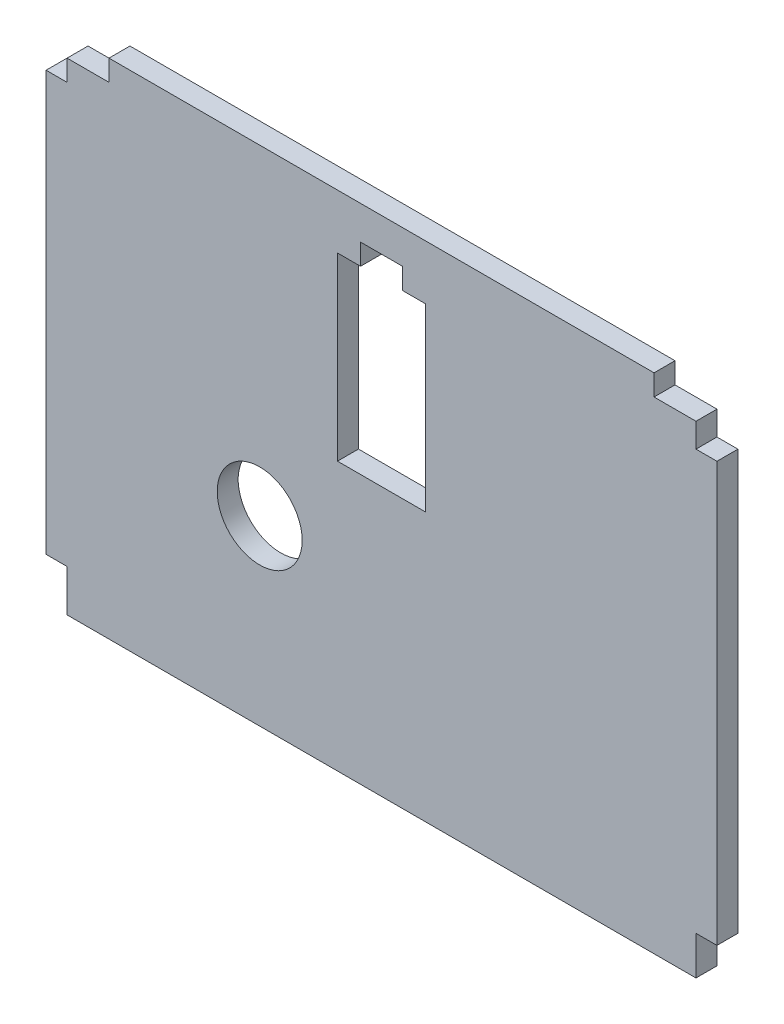
ISO-10303-21;
HEADER;
FILE_DESCRIPTION(('STEP AP214'),'2;1');
FILE_NAME('part.step','',(''),(''),'','','');
FILE_SCHEMA(('AUTOMOTIVE_DESIGN { 1 0 10303 214 1 1 1 1 }'));
ENDSEC;
DATA;
#1=APPLICATION_CONTEXT('core data for automotive mechanical design processes');
#2=APPLICATION_PROTOCOL_DEFINITION('international standard','automotive_design',2000,#1);
#3=PRODUCT_CONTEXT('',#1,'mechanical');
#4=PRODUCT('Part','Part','',(#3));
#5=PRODUCT_RELATED_PRODUCT_CATEGORY('part','',(#4));
#6=PRODUCT_DEFINITION_FORMATION('','',#4);
#7=PRODUCT_DEFINITION_CONTEXT('part definition',#1,'design');
#8=PRODUCT_DEFINITION('design','',#6,#7);
#9=PRODUCT_DEFINITION_SHAPE('','',#8);
#10=(LENGTH_UNIT() NAMED_UNIT(*) SI_UNIT(.MILLI.,.METRE.));
#11=(NAMED_UNIT(*) PLANE_ANGLE_UNIT() SI_UNIT($,.RADIAN.));
#12=(NAMED_UNIT(*) SI_UNIT($,.STERADIAN.) SOLID_ANGLE_UNIT());
#13=UNCERTAINTY_MEASURE_WITH_UNIT(LENGTH_MEASURE(1.E-05),#10,'distance_accuracy_value','');
#14=(GEOMETRIC_REPRESENTATION_CONTEXT(3) GLOBAL_UNCERTAINTY_ASSIGNED_CONTEXT((#13)) GLOBAL_UNIT_ASSIGNED_CONTEXT((#10,
#11,#12)) REPRESENTATION_CONTEXT('',''));
#15=CARTESIAN_POINT('',(0.,0.,0.));
#16=DIRECTION('',(0.,0.,1.));
#17=DIRECTION('',(1.,0.,0.));
#18=AXIS2_PLACEMENT_3D('',#15,#16,#17);
#19=CARTESIAN_POINT('',(58.9567249569248,45.028653295129,5.));
#20=DIRECTION('',(-1.,0.,0.));
#21=DIRECTION('',(0.,0.,1.));
#22=AXIS2_PLACEMENT_3D('',#19,#20,#21);
#23=PLANE('',#22);
#24=DIRECTION('',(0.,1.,0.));
#25=VECTOR('',#24,1.);
#26=CARTESIAN_POINT('',(58.9567249569248,45.028653295129,0.));
#27=LINE('',#26,#25);
#28=CARTESIAN_POINT('',(58.9567249569248,45.028653295129,0.));
#29=VERTEX_POINT('',#28);
#30=CARTESIAN_POINT('',(58.9567249569248,50.028653295129,0.));
#31=VERTEX_POINT('',#30);
#32=EDGE_CURVE('E284',#29,#31,#27,.T.);
#33=ORIENTED_EDGE('',*,*,#32,.T.);
#34=DIRECTION('',(0.,0.,-1.));
#35=VECTOR('',#34,1.);
#36=CARTESIAN_POINT('',(58.9567249569248,50.028653295129,5.));
#37=LINE('',#36,#35);
#38=CARTESIAN_POINT('',(58.9567249569248,50.028653295129,5.));
#39=VERTEX_POINT('',#38);
#40=EDGE_CURVE('E11',#39,#31,#37,.T.);
#41=ORIENTED_EDGE('',*,*,#40,.F.);
#42=DIRECTION('',(0.,1.,0.));
#43=VECTOR('',#42,1.);
#44=CARTESIAN_POINT('',(58.9567249569248,45.028653295129,5.));
#45=LINE('',#44,#43);
#46=CARTESIAN_POINT('',(58.9567249569248,45.028653295129,5.));
#47=VERTEX_POINT('',#46);
#48=EDGE_CURVE('E302',#47,#39,#45,.T.);
#49=ORIENTED_EDGE('',*,*,#48,.F.);
#50=DIRECTION('',(0.,0.,-1.));
#51=VECTOR('',#50,1.);
#52=CARTESIAN_POINT('',(58.9567249569248,45.028653295129,5.));
#53=LINE('',#52,#51);
#54=EDGE_CURVE('E357',#47,#29,#53,.T.);
#55=ORIENTED_EDGE('',*,*,#54,.T.);
#56=EDGE_LOOP('',(#33,#41,#49,#55));
#57=FACE_BOUND('',#56,.T.);
#58=ADVANCED_FACE('F45',(#57),#23,.F.);
#59=CARTESIAN_POINT('',(58.9567249569248,50.028653295129,5.));
#60=DIRECTION('',(0.,-1.,0.));
#61=DIRECTION('',(0.,0.,-1.));
#62=AXIS2_PLACEMENT_3D('',#59,#60,#61);
#63=PLANE('',#62);
#64=DIRECTION('',(-1.,0.,0.));
#65=VECTOR('',#64,1.);
#66=CARTESIAN_POINT('',(58.9567249569248,50.028653295129,0.));
#67=LINE('',#66,#65);
#68=CARTESIAN_POINT('',(-71.0432750430752,50.028653295129,0.));
#69=VERTEX_POINT('',#68);
#70=EDGE_CURVE('E361',#31,#69,#67,.T.);
#71=ORIENTED_EDGE('',*,*,#70,.T.);
#72=DIRECTION('',(0.,0.,-1.));
#73=VECTOR('',#72,1.);
#74=CARTESIAN_POINT('',(-71.0432750430752,50.028653295129,5.));
#75=LINE('',#74,#73);
#76=CARTESIAN_POINT('',(-71.0432750430752,50.028653295129,5.));
#77=VERTEX_POINT('',#76);
#78=EDGE_CURVE('E54',#77,#69,#75,.T.);
#79=ORIENTED_EDGE('',*,*,#78,.F.);
#80=DIRECTION('',(-1.,0.,0.));
#81=VECTOR('',#80,1.);
#82=CARTESIAN_POINT('',(58.9567249569248,50.028653295129,5.));
#83=LINE('',#82,#81);
#84=EDGE_CURVE('E306',#39,#77,#83,.T.);
#85=ORIENTED_EDGE('',*,*,#84,.F.);
#86=ORIENTED_EDGE('',*,*,#40,.T.);
#87=EDGE_LOOP('',(#71,#79,#85,#86));
#88=FACE_BOUND('',#87,.T.);
#89=ADVANCED_FACE('F468',(#88),#63,.F.);
#90=CARTESIAN_POINT('',(-71.0432750430752,45.0286532951289,5.));
#91=DIRECTION('',(-1.,0.,0.));
#92=DIRECTION('',(0.,0.,1.));
#93=AXIS2_PLACEMENT_3D('',#90,#91,#92);
#94=PLANE('',#93);
#95=DIRECTION('',(0.,1.,0.));
#96=VECTOR('',#95,1.);
#97=CARTESIAN_POINT('',(-71.0432750430752,45.0286532951289,0.));
#98=LINE('',#97,#96);
#99=CARTESIAN_POINT('',(-71.0432750430752,45.0286532951289,0.));
#100=VERTEX_POINT('',#99);
#101=EDGE_CURVE('E365',#100,#69,#98,.T.);
#102=ORIENTED_EDGE('',*,*,#101,.F.);
#103=DIRECTION('',(0.,0.,-1.));
#104=VECTOR('',#103,1.);
#105=CARTESIAN_POINT('',(-71.0432750430752,45.0286532951289,5.));
#106=LINE('',#105,#104);
#107=CARTESIAN_POINT('',(-71.0432750430752,45.0286532951289,5.));
#108=VERTEX_POINT('',#107);
#109=EDGE_CURVE('E458',#108,#100,#106,.T.);
#110=ORIENTED_EDGE('',*,*,#109,.F.);
#111=DIRECTION('',(0.,1.,0.));
#112=VECTOR('',#111,1.);
#113=CARTESIAN_POINT('',(-71.0432750430752,45.0286532951289,5.));
#114=LINE('',#113,#112);
#115=EDGE_CURVE('E310',#108,#77,#114,.T.);
#116=ORIENTED_EDGE('',*,*,#115,.T.);
#117=ORIENTED_EDGE('',*,*,#78,.T.);
#118=EDGE_LOOP('',(#102,#110,#116,#117));
#119=FACE_BOUND('',#118,.T.);
#120=ADVANCED_FACE('F465',(#119),#94,.T.);
#121=CARTESIAN_POINT('',(-71.0432750430752,45.0286532951289,5.));
#122=DIRECTION('',(0.,-1.,0.));
#123=DIRECTION('',(0.,0.,-1.));
#124=AXIS2_PLACEMENT_3D('',#121,#122,#123);
#125=PLANE('',#124);
#126=DIRECTION('',(-1.,0.,0.));
#127=VECTOR('',#126,1.);
#128=CARTESIAN_POINT('',(-71.0432750430752,45.0286532951289,0.));
#129=LINE('',#128,#127);
#130=CARTESIAN_POINT('',(-81.0432750430752,45.0286532951289,0.));
#131=VERTEX_POINT('',#130);
#132=EDGE_CURVE('E369',#100,#131,#129,.T.);
#133=ORIENTED_EDGE('',*,*,#132,.T.);
#134=DIRECTION('',(0.,0.,-1.));
#135=VECTOR('',#134,1.);
#136=CARTESIAN_POINT('',(-81.0432750430752,45.0286532951289,5.));
#137=LINE('',#136,#135);
#138=CARTESIAN_POINT('',(-81.0432750430752,45.0286532951289,5.));
#139=VERTEX_POINT('',#138);
#140=EDGE_CURVE('E455',#139,#131,#137,.T.);
#141=ORIENTED_EDGE('',*,*,#140,.F.);
#142=DIRECTION('',(-1.,0.,0.));
#143=VECTOR('',#142,1.);
#144=CARTESIAN_POINT('',(-71.0432750430752,45.0286532951289,5.));
#145=LINE('',#144,#143);
#146=EDGE_CURVE('E314',#108,#139,#145,.T.);
#147=ORIENTED_EDGE('',*,*,#146,.F.);
#148=ORIENTED_EDGE('',*,*,#109,.T.);
#149=EDGE_LOOP('',(#133,#141,#147,#148));
#150=FACE_BOUND('',#149,.T.);
#151=ADVANCED_FACE('F475',(#150),#125,.F.);
#152=CARTESIAN_POINT('',(-81.0432750430752,40.028653295129,5.));
#153=DIRECTION('',(-1.,0.,0.));
#154=DIRECTION('',(0.,0.,1.));
#155=AXIS2_PLACEMENT_3D('',#152,#153,#154);
#156=PLANE('',#155);
#157=DIRECTION('',(0.,1.,0.));
#158=VECTOR('',#157,1.);
#159=CARTESIAN_POINT('',(-81.0432750430752,40.028653295129,0.));
#160=LINE('',#159,#158);
#161=CARTESIAN_POINT('',(-81.0432750430752,40.028653295129,0.));
#162=VERTEX_POINT('',#161);
#163=EDGE_CURVE('E373',#162,#131,#160,.T.);
#164=ORIENTED_EDGE('',*,*,#163,.F.);
#165=DIRECTION('',(0.,0.,-1.));
#166=VECTOR('',#165,1.);
#167=CARTESIAN_POINT('',(-81.0432750430752,40.028653295129,5.));
#168=LINE('',#167,#166);
#169=CARTESIAN_POINT('',(-81.0432750430752,40.028653295129,5.));
#170=VERTEX_POINT('',#169);
#171=EDGE_CURVE('E452',#170,#162,#168,.T.);
#172=ORIENTED_EDGE('',*,*,#171,.F.);
#173=DIRECTION('',(0.,1.,0.));
#174=VECTOR('',#173,1.);
#175=CARTESIAN_POINT('',(-81.0432750430752,40.028653295129,5.));
#176=LINE('',#175,#174);
#177=EDGE_CURVE('E317',#170,#139,#176,.T.);
#178=ORIENTED_EDGE('',*,*,#177,.T.);
#179=ORIENTED_EDGE('',*,*,#140,.T.);
#180=EDGE_LOOP('',(#164,#172,#178,#179));
#181=FACE_BOUND('',#180,.T.);
#182=ADVANCED_FACE('F535',(#181),#156,.T.);
#183=CARTESIAN_POINT('',(-86.0432750430752,40.028653295129,5.));
#184=DIRECTION('',(0.,1.,0.));
#185=DIRECTION('',(0.,0.,1.));
#186=AXIS2_PLACEMENT_3D('',#183,#184,#185);
#187=PLANE('',#186);
#188=DIRECTION('',(1.,0.,0.));
#189=VECTOR('',#188,1.);
#190=CARTESIAN_POINT('',(-86.0432750430752,40.028653295129,0.));
#191=LINE('',#190,#189);
#192=CARTESIAN_POINT('',(-86.0432750430752,40.028653295129,0.));
#193=VERTEX_POINT('',#192);
#194=EDGE_CURVE('E377',#193,#162,#191,.T.);
#195=ORIENTED_EDGE('',*,*,#194,.F.);
#196=DIRECTION('',(0.,0.,-1.));
#197=VECTOR('',#196,1.);
#198=CARTESIAN_POINT('',(-86.0432750430752,40.028653295129,5.));
#199=LINE('',#198,#197);
#200=CARTESIAN_POINT('',(-86.0432750430752,40.028653295129,5.));
#201=VERTEX_POINT('',#200);
#202=EDGE_CURVE('E449',#201,#193,#199,.T.);
#203=ORIENTED_EDGE('',*,*,#202,.F.);
#204=DIRECTION('',(1.,0.,0.));
#205=VECTOR('',#204,1.);
#206=CARTESIAN_POINT('',(-86.0432750430752,40.028653295129,5.));
#207=LINE('',#206,#205);
#208=EDGE_CURVE('E321',#201,#170,#207,.T.);
#209=ORIENTED_EDGE('',*,*,#208,.T.);
#210=ORIENTED_EDGE('',*,*,#171,.T.);
#211=EDGE_LOOP('',(#195,#203,#209,#210));
#212=FACE_BOUND('',#211,.T.);
#213=ADVANCED_FACE('F533',(#212),#187,.T.);
#214=CARTESIAN_POINT('',(-86.0432750430752,40.028653295129,5.));
#215=DIRECTION('',(1.,0.,0.));
#216=DIRECTION('',(0.,0.,-1.));
#217=AXIS2_PLACEMENT_3D('',#214,#215,#216);
#218=PLANE('',#217);
#219=DIRECTION('',(0.,-1.,0.));
#220=VECTOR('',#219,1.);
#221=CARTESIAN_POINT('',(-86.0432750430752,40.028653295129,0.));
#222=LINE('',#221,#220);
#223=CARTESIAN_POINT('',(-86.0432750430752,-59.9713467048711,0.));
#224=VERTEX_POINT('',#223);
#225=EDGE_CURVE('E381',#193,#224,#222,.T.);
#226=ORIENTED_EDGE('',*,*,#225,.T.);
#227=DIRECTION('',(0.,0.,-1.));
#228=VECTOR('',#227,1.);
#229=CARTESIAN_POINT('',(-86.0432750430752,-59.9713467048711,5.));
#230=LINE('',#229,#228);
#231=CARTESIAN_POINT('',(-86.0432750430752,-59.9713467048711,5.));
#232=VERTEX_POINT('',#231);
#233=EDGE_CURVE('E445',#232,#224,#230,.T.);
#234=ORIENTED_EDGE('',*,*,#233,.F.);
#235=DIRECTION('',(0.,-1.,0.));
#236=VECTOR('',#235,1.);
#237=CARTESIAN_POINT('',(-86.0432750430752,40.028653295129,5.));
#238=LINE('',#237,#236);
#239=EDGE_CURVE('E325',#201,#232,#238,.T.);
#240=ORIENTED_EDGE('',*,*,#239,.F.);
#241=ORIENTED_EDGE('',*,*,#202,.T.);
#242=EDGE_LOOP('',(#226,#234,#240,#241));
#243=FACE_BOUND('',#242,.T.);
#244=ADVANCED_FACE('F529',(#243),#218,.F.);
#245=CARTESIAN_POINT('',(-86.0432750430752,-59.9713467048711,5.));
#246=DIRECTION('',(0.,1.,0.));
#247=DIRECTION('',(0.,0.,1.));
#248=AXIS2_PLACEMENT_3D('',#245,#246,#247);
#249=PLANE('',#248);
#250=DIRECTION('',(1.,0.,0.));
#251=VECTOR('',#250,1.);
#252=CARTESIAN_POINT('',(-86.0432750430752,-59.9713467048711,0.));
#253=LINE('',#252,#251);
#254=CARTESIAN_POINT('',(-81.0432750430752,-59.9713467048711,0.));
#255=VERTEX_POINT('',#254);
#256=EDGE_CURVE('E384',#224,#255,#253,.T.);
#257=ORIENTED_EDGE('',*,*,#256,.T.);
#258=DIRECTION('',(0.,0.,-1.));
#259=VECTOR('',#258,1.);
#260=CARTESIAN_POINT('',(-81.0432750430752,-59.9713467048711,5.));
#261=LINE('',#260,#259);
#262=CARTESIAN_POINT('',(-81.0432750430752,-59.9713467048711,5.));
#263=VERTEX_POINT('',#262);
#264=EDGE_CURVE('E441',#263,#255,#261,.T.);
#265=ORIENTED_EDGE('',*,*,#264,.F.);
#266=DIRECTION('',(1.,0.,0.));
#267=VECTOR('',#266,1.);
#268=CARTESIAN_POINT('',(-86.0432750430752,-59.9713467048711,5.));
#269=LINE('',#268,#267);
#270=EDGE_CURVE('E328',#232,#263,#269,.T.);
#271=ORIENTED_EDGE('',*,*,#270,.F.);
#272=ORIENTED_EDGE('',*,*,#233,.T.);
#273=EDGE_LOOP('',(#257,#265,#271,#272));
#274=FACE_BOUND('',#273,.T.);
#275=ADVANCED_FACE('F525',(#274),#249,.F.);
#276=CARTESIAN_POINT('',(-81.0432750430752,-59.9713467048711,5.));
#277=DIRECTION('',(1.,0.,0.));
#278=DIRECTION('',(0.,1.,0.));
#279=AXIS2_PLACEMENT_3D('',#276,#277,#278);
#280=PLANE('',#279);
#281=DIRECTION('',(0.,-1.,0.));
#282=VECTOR('',#281,1.);
#283=CARTESIAN_POINT('',(-81.0432750430752,-59.9713467048711,0.));
#284=LINE('',#283,#282);
#285=CARTESIAN_POINT('',(-81.0432750430752,-69.971346704871,0.));
#286=VERTEX_POINT('',#285);
#287=EDGE_CURVE('E387',#255,#286,#284,.T.);
#288=ORIENTED_EDGE('',*,*,#287,.T.);
#289=DIRECTION('',(0.,0.,-1.));
#290=VECTOR('',#289,1.);
#291=CARTESIAN_POINT('',(-81.0432750430752,-69.971346704871,5.));
#292=LINE('',#291,#290);
#293=CARTESIAN_POINT('',(-81.0432750430752,-69.971346704871,5.));
#294=VERTEX_POINT('',#293);
#295=EDGE_CURVE('E437',#294,#286,#292,.T.);
#296=ORIENTED_EDGE('',*,*,#295,.F.);
#297=DIRECTION('',(0.,-1.,0.));
#298=VECTOR('',#297,1.);
#299=CARTESIAN_POINT('',(-81.0432750430752,-59.9713467048711,5.));
#300=LINE('',#299,#298);
#301=EDGE_CURVE('E331',#263,#294,#300,.T.);
#302=ORIENTED_EDGE('',*,*,#301,.F.);
#303=ORIENTED_EDGE('',*,*,#264,.T.);
#304=EDGE_LOOP('',(#288,#296,#302,#303));
#305=FACE_BOUND('',#304,.T.);
#306=ADVANCED_FACE('F520',(#305),#280,.F.);
#307=CARTESIAN_POINT('',(-81.0432750430752,-69.971346704871,5.));
#308=DIRECTION('',(0.,1.,0.));
#309=DIRECTION('',(0.,0.,1.));
#310=AXIS2_PLACEMENT_3D('',#307,#308,#309);
#311=PLANE('',#310);
#312=DIRECTION('',(1.,0.,0.));
#313=VECTOR('',#312,1.);
#314=CARTESIAN_POINT('',(-81.0432750430752,-69.971346704871,0.));
#315=LINE('',#314,#313);
#316=CARTESIAN_POINT('',(68.9567249569248,-69.971346704871,0.));
#317=VERTEX_POINT('',#316);
#318=EDGE_CURVE('E390',#286,#317,#315,.T.);
#319=ORIENTED_EDGE('',*,*,#318,.T.);
#320=DIRECTION('',(0.,0.,-1.));
#321=VECTOR('',#320,1.);
#322=CARTESIAN_POINT('',(68.9567249569248,-69.971346704871,5.));
#323=LINE('',#322,#321);
#324=CARTESIAN_POINT('',(68.9567249569248,-69.971346704871,5.));
#325=VERTEX_POINT('',#324);
#326=EDGE_CURVE('E433',#325,#317,#323,.T.);
#327=ORIENTED_EDGE('',*,*,#326,.F.);
#328=DIRECTION('',(1.,0.,0.));
#329=VECTOR('',#328,1.);
#330=CARTESIAN_POINT('',(-81.0432750430752,-69.971346704871,5.));
#331=LINE('',#330,#329);
#332=EDGE_CURVE('E334',#294,#325,#331,.T.);
#333=ORIENTED_EDGE('',*,*,#332,.F.);
#334=ORIENTED_EDGE('',*,*,#295,.T.);
#335=EDGE_LOOP('',(#319,#327,#333,#334));
#336=FACE_BOUND('',#335,.T.);
#337=ADVANCED_FACE('F514',(#336),#311,.F.);
#338=CARTESIAN_POINT('',(68.9567249569248,-69.971346704871,5.));
#339=DIRECTION('',(-1.,0.,0.));
#340=DIRECTION('',(0.,-1.,0.));
#341=AXIS2_PLACEMENT_3D('',#338,#339,#340);
#342=PLANE('',#341);
#343=DIRECTION('',(0.,1.,0.));
#344=VECTOR('',#343,1.);
#345=CARTESIAN_POINT('',(68.9567249569248,-69.971346704871,0.));
#346=LINE('',#345,#344);
#347=CARTESIAN_POINT('',(68.9567249569248,-60.7378352529943,0.));
#348=VERTEX_POINT('',#347);
#349=EDGE_CURVE('E393',#317,#348,#346,.T.);
#350=ORIENTED_EDGE('',*,*,#349,.T.);
#351=DIRECTION('',(0.,0.,-1.));
#352=VECTOR('',#351,1.);
#353=CARTESIAN_POINT('',(68.9567249569248,-60.7378352529943,5.));
#354=LINE('',#353,#352);
#355=CARTESIAN_POINT('',(68.9567249569248,-60.7378352529943,5.));
#356=VERTEX_POINT('',#355);
#357=EDGE_CURVE('E429',#356,#348,#354,.T.);
#358=ORIENTED_EDGE('',*,*,#357,.F.);
#359=DIRECTION('',(0.,1.,0.));
#360=VECTOR('',#359,1.);
#361=CARTESIAN_POINT('',(68.9567249569248,-69.971346704871,5.));
#362=LINE('',#361,#360);
#363=EDGE_CURVE('E337',#325,#356,#362,.T.);
#364=ORIENTED_EDGE('',*,*,#363,.F.);
#365=ORIENTED_EDGE('',*,*,#326,.T.);
#366=EDGE_LOOP('',(#350,#358,#364,#365));
#367=FACE_BOUND('',#366,.T.);
#368=ADVANCED_FACE('F510',(#367),#342,.F.);
#369=CARTESIAN_POINT('',(68.9567249569248,-60.7378352529943,5.));
#370=DIRECTION('',(0.,1.,0.));
#371=DIRECTION('',(0.,0.,1.));
#372=AXIS2_PLACEMENT_3D('',#369,#370,#371);
#373=PLANE('',#372);
#374=DIRECTION('',(1.,0.,0.));
#375=VECTOR('',#374,1.);
#376=CARTESIAN_POINT('',(68.9567249569248,-60.7378352529943,0.));
#377=LINE('',#376,#375);
#378=CARTESIAN_POINT('',(73.9567249569248,-60.7378352529943,0.));
#379=VERTEX_POINT('',#378);
#380=EDGE_CURVE('E396',#348,#379,#377,.T.);
#381=ORIENTED_EDGE('',*,*,#380,.T.);
#382=DIRECTION('',(0.,0.,-1.));
#383=VECTOR('',#382,1.);
#384=CARTESIAN_POINT('',(73.9567249569248,-60.7378352529943,5.));
#385=LINE('',#384,#383);
#386=CARTESIAN_POINT('',(73.9567249569248,-60.7378352529943,5.));
#387=VERTEX_POINT('',#386);
#388=EDGE_CURVE('E425',#387,#379,#385,.T.);
#389=ORIENTED_EDGE('',*,*,#388,.F.);
#390=DIRECTION('',(1.,0.,0.));
#391=VECTOR('',#390,1.);
#392=CARTESIAN_POINT('',(68.9567249569248,-60.7378352529943,5.));
#393=LINE('',#392,#391);
#394=EDGE_CURVE('E340',#356,#387,#393,.T.);
#395=ORIENTED_EDGE('',*,*,#394,.F.);
#396=ORIENTED_EDGE('',*,*,#357,.T.);
#397=EDGE_LOOP('',(#381,#389,#395,#396));
#398=FACE_BOUND('',#397,.T.);
#399=ADVANCED_FACE('F505',(#398),#373,.F.);
#400=CARTESIAN_POINT('',(73.9567249569248,-60.7378352529943,5.));
#401=DIRECTION('',(-1.,0.,0.));
#402=DIRECTION('',(0.,0.,1.));
#403=AXIS2_PLACEMENT_3D('',#400,#401,#402);
#404=PLANE('',#403);
#405=DIRECTION('',(0.,1.,0.));
#406=VECTOR('',#405,1.);
#407=CARTESIAN_POINT('',(73.9567249569248,-60.7378352529943,0.));
#408=LINE('',#407,#406);
#409=CARTESIAN_POINT('',(73.9567249569248,39.2621647470057,0.));
#410=VERTEX_POINT('',#409);
#411=EDGE_CURVE('E399',#379,#410,#408,.T.);
#412=ORIENTED_EDGE('',*,*,#411,.T.);
#413=DIRECTION('',(0.,0.,-1.));
#414=VECTOR('',#413,1.);
#415=CARTESIAN_POINT('',(73.9567249569248,39.2621647470057,5.));
#416=LINE('',#415,#414);
#417=CARTESIAN_POINT('',(73.9567249569248,39.2621647470057,5.));
#418=VERTEX_POINT('',#417);
#419=EDGE_CURVE('E422',#418,#410,#416,.T.);
#420=ORIENTED_EDGE('',*,*,#419,.F.);
#421=DIRECTION('',(0.,1.,0.));
#422=VECTOR('',#421,1.);
#423=CARTESIAN_POINT('',(73.9567249569248,-60.7378352529943,5.));
#424=LINE('',#423,#422);
#425=EDGE_CURVE('E343',#387,#418,#424,.T.);
#426=ORIENTED_EDGE('',*,*,#425,.F.);
#427=ORIENTED_EDGE('',*,*,#388,.T.);
#428=EDGE_LOOP('',(#412,#420,#426,#427));
#429=FACE_BOUND('',#428,.T.);
#430=ADVANCED_FACE('F499',(#429),#404,.F.);
#431=CARTESIAN_POINT('',(68.9567249569248,39.2621647470057,5.));
#432=DIRECTION('',(0.,1.,0.));
#433=DIRECTION('',(0.,0.,1.));
#434=AXIS2_PLACEMENT_3D('',#431,#432,#433);
#435=PLANE('',#434);
#436=DIRECTION('',(1.,0.,0.));
#437=VECTOR('',#436,1.);
#438=CARTESIAN_POINT('',(68.9567249569248,39.2621647470057,0.));
#439=LINE('',#438,#437);
#440=CARTESIAN_POINT('',(68.9567249569248,39.2621647470057,0.));
#441=VERTEX_POINT('',#440);
#442=EDGE_CURVE('E403',#441,#410,#439,.T.);
#443=ORIENTED_EDGE('',*,*,#442,.F.);
#444=DIRECTION('',(0.,0.,-1.));
#445=VECTOR('',#444,1.);
#446=CARTESIAN_POINT('',(68.9567249569248,39.2621647470057,5.));
#447=LINE('',#446,#445);
#448=CARTESIAN_POINT('',(68.9567249569248,39.2621647470057,5.));
#449=VERTEX_POINT('',#448);
#450=EDGE_CURVE('E419',#449,#441,#447,.T.);
#451=ORIENTED_EDGE('',*,*,#450,.F.);
#452=DIRECTION('',(1.,0.,0.));
#453=VECTOR('',#452,1.);
#454=CARTESIAN_POINT('',(68.9567249569248,39.2621647470057,5.));
#455=LINE('',#454,#453);
#456=EDGE_CURVE('E346',#449,#418,#455,.T.);
#457=ORIENTED_EDGE('',*,*,#456,.T.);
#458=ORIENTED_EDGE('',*,*,#419,.T.);
#459=EDGE_LOOP('',(#443,#451,#457,#458));
#460=FACE_BOUND('',#459,.T.);
#461=ADVANCED_FACE('F494',(#460),#435,.T.);
#462=CARTESIAN_POINT('',(68.9567249569248,39.2621647470057,5.));
#463=DIRECTION('',(-1.,0.,0.));
#464=DIRECTION('',(0.,0.,1.));
#465=AXIS2_PLACEMENT_3D('',#462,#463,#464);
#466=PLANE('',#465);
#467=DIRECTION('',(0.,1.,0.));
#468=VECTOR('',#467,1.);
#469=CARTESIAN_POINT('',(68.9567249569248,39.2621647470057,0.));
#470=LINE('',#469,#468);
#471=CARTESIAN_POINT('',(68.9567249569248,45.028653295129,0.));
#472=VERTEX_POINT('',#471);
#473=EDGE_CURVE('E407',#441,#472,#470,.T.);
#474=ORIENTED_EDGE('',*,*,#473,.T.);
#475=DIRECTION('',(0.,0.,-1.));
#476=VECTOR('',#475,1.);
#477=CARTESIAN_POINT('',(68.9567249569248,45.028653295129,5.));
#478=LINE('',#477,#476);
#479=CARTESIAN_POINT('',(68.9567249569248,45.028653295129,5.));
#480=VERTEX_POINT('',#479);
#481=EDGE_CURVE('E416',#480,#472,#478,.T.);
#482=ORIENTED_EDGE('',*,*,#481,.F.);
#483=DIRECTION('',(0.,1.,0.));
#484=VECTOR('',#483,1.);
#485=CARTESIAN_POINT('',(68.9567249569248,39.2621647470057,5.));
#486=LINE('',#485,#484);
#487=EDGE_CURVE('E350',#449,#480,#486,.T.);
#488=ORIENTED_EDGE('',*,*,#487,.F.);
#489=ORIENTED_EDGE('',*,*,#450,.T.);
#490=EDGE_LOOP('',(#474,#482,#488,#489));
#491=FACE_BOUND('',#490,.T.);
#492=ADVANCED_FACE('F490',(#491),#466,.F.);
#493=CARTESIAN_POINT('',(58.9567249569248,45.028653295129,5.));
#494=DIRECTION('',(0.,1.,0.));
#495=DIRECTION('',(0.,0.,1.));
#496=AXIS2_PLACEMENT_3D('',#493,#494,#495);
#497=PLANE('',#496);
#498=DIRECTION('',(1.,0.,0.));
#499=VECTOR('',#498,1.);
#500=CARTESIAN_POINT('',(58.9567249569248,45.028653295129,0.));
#501=LINE('',#500,#499);
#502=EDGE_CURVE('E307',#29,#472,#501,.T.);
#503=ORIENTED_EDGE('',*,*,#502,.F.);
#504=ORIENTED_EDGE('',*,*,#54,.F.);
#505=DIRECTION('',(1.,0.,0.));
#506=VECTOR('',#505,1.);
#507=CARTESIAN_POINT('',(58.9567249569248,45.028653295129,5.));
#508=LINE('',#507,#506);
#509=EDGE_CURVE('E353',#47,#480,#508,.T.);
#510=ORIENTED_EDGE('',*,*,#509,.T.);
#511=ORIENTED_EDGE('',*,*,#481,.T.);
#512=EDGE_LOOP('',(#503,#504,#510,#511));
#513=FACE_BOUND('',#512,.T.);
#514=ADVANCED_FACE('F486',(#513),#497,.T.);
#515=CARTESIAN_POINT('',(0.,0.,5.));
#516=DIRECTION('',(0.,0.,1.));
#517=DIRECTION('',(1.,0.,0.));
#518=AXIS2_PLACEMENT_3D('',#515,#516,#517);
#519=PLANE('',#518);
#520=CARTESIAN_POINT('',(-35.0986045026042,-26.5621117512885,5.));
#521=DIRECTION('',(0.,0.,1.));
#522=DIRECTION('',(1.,0.,0.));
#523=AXIS2_PLACEMENT_3D('',#520,#521,#522);
#524=CIRCLE('',#523,10.1333724821669);
#525=CARTESIAN_POINT('',(-24.9652320204374,-26.5621117512885,5.));
#526=VERTEX_POINT('',#525);
#527=EDGE_CURVE('E236',#526,#526,#524,.T.);
#528=ORIENTED_EDGE('',*,*,#527,.F.);
#529=EDGE_LOOP('',(#528));
#530=FACE_BOUND('',#529,.T.);
#531=DIRECTION('',(-1.,0.,0.));
#532=VECTOR('',#531,1.);
#533=CARTESIAN_POINT('',(-16.5432750430752,37.028653295129,5.));
#534=LINE('',#533,#532);
#535=CARTESIAN_POINT('',(-11.0432750430752,37.028653295129,5.));
#536=VERTEX_POINT('',#535);
#537=CARTESIAN_POINT('',(-16.5432750430752,37.028653295129,5.));
#538=VERTEX_POINT('',#537);
#539=EDGE_CURVE('E61',#536,#538,#534,.T.);
#540=ORIENTED_EDGE('',*,*,#539,.F.);
#541=DIRECTION('',(0.,-1.,0.));
#542=VECTOR('',#541,1.);
#543=CARTESIAN_POINT('',(-11.0432750430752,42.028653295129,5.));
#544=LINE('',#543,#542);
#545=CARTESIAN_POINT('',(-11.0432750430752,42.028653295129,5.));
#546=VERTEX_POINT('',#545);
#547=EDGE_CURVE('E229',#546,#536,#544,.T.);
#548=ORIENTED_EDGE('',*,*,#547,.F.);
#549=DIRECTION('',(-1.,0.,0.));
#550=VECTOR('',#549,1.);
#551=CARTESIAN_POINT('',(-6.04327504307517,42.028653295129,5.));
#552=LINE('',#551,#550);
#553=CARTESIAN_POINT('',(-1.04327504307517,42.028653295129,5.));
#554=VERTEX_POINT('',#553);
#555=EDGE_CURVE('E233',#554,#546,#552,.T.);
#556=ORIENTED_EDGE('',*,*,#555,.F.);
#557=DIRECTION('',(0.,1.,0.));
#558=VECTOR('',#557,1.);
#559=CARTESIAN_POINT('',(-1.04327504307517,37.028653295129,5.));
#560=LINE('',#559,#558);
#561=CARTESIAN_POINT('',(-1.04327504307517,37.028653295129,5.));
#562=VERTEX_POINT('',#561);
#563=EDGE_CURVE('E274',#562,#554,#560,.T.);
#564=ORIENTED_EDGE('',*,*,#563,.F.);
#565=DIRECTION('',(-1.,0.,0.));
#566=VECTOR('',#565,1.);
#567=CARTESIAN_POINT('',(-1.04327504307517,37.028653295129,5.));
#568=LINE('',#567,#566);
#569=CARTESIAN_POINT('',(4.45672495692483,37.028653295129,5.));
#570=VERTEX_POINT('',#569);
#571=EDGE_CURVE('E270',#570,#562,#568,.T.);
#572=ORIENTED_EDGE('',*,*,#571,.F.);
#573=DIRECTION('',(0.,1.,0.));
#574=VECTOR('',#573,1.);
#575=CARTESIAN_POINT('',(4.45672495692483,37.028653295129,5.));
#576=LINE('',#575,#574);
#577=CARTESIAN_POINT('',(4.45672495692484,-5.97134670487103,5.));
#578=VERTEX_POINT('',#577);
#579=EDGE_CURVE('E266',#578,#570,#576,.T.);
#580=ORIENTED_EDGE('',*,*,#579,.F.);
#581=DIRECTION('',(1.,0.,0.));
#582=VECTOR('',#581,1.);
#583=CARTESIAN_POINT('',(-16.5432750430752,-5.97134670487104,5.));
#584=LINE('',#583,#582);
#585=CARTESIAN_POINT('',(-16.5432750430752,-5.97134670487104,5.));
#586=VERTEX_POINT('',#585);
#587=EDGE_CURVE('E262',#586,#578,#584,.T.);
#588=ORIENTED_EDGE('',*,*,#587,.F.);
#589=DIRECTION('',(0.,-1.,0.));
#590=VECTOR('',#589,1.);
#591=CARTESIAN_POINT('',(-16.5432750430752,37.028653295129,5.));
#592=LINE('',#591,#590);
#593=EDGE_CURVE('E259',#538,#586,#592,.T.);
#594=ORIENTED_EDGE('',*,*,#593,.F.);
#595=EDGE_LOOP('',(#540,#548,#556,#564,#572,#580,#588,#594));
#596=FACE_BOUND('',#595,.T.);
#597=ORIENTED_EDGE('',*,*,#48,.T.);
#598=ORIENTED_EDGE('',*,*,#84,.T.);
#599=ORIENTED_EDGE('',*,*,#115,.F.);
#600=ORIENTED_EDGE('',*,*,#146,.T.);
#601=ORIENTED_EDGE('',*,*,#177,.F.);
#602=ORIENTED_EDGE('',*,*,#208,.F.);
#603=ORIENTED_EDGE('',*,*,#239,.T.);
#604=ORIENTED_EDGE('',*,*,#270,.T.);
#605=ORIENTED_EDGE('',*,*,#301,.T.);
#606=ORIENTED_EDGE('',*,*,#332,.T.);
#607=ORIENTED_EDGE('',*,*,#363,.T.);
#608=ORIENTED_EDGE('',*,*,#394,.T.);
#609=ORIENTED_EDGE('',*,*,#425,.T.);
#610=ORIENTED_EDGE('',*,*,#456,.F.);
#611=ORIENTED_EDGE('',*,*,#487,.T.);
#612=ORIENTED_EDGE('',*,*,#509,.F.);
#613=EDGE_LOOP('',(#597,#598,#599,#600,#601,#602,#603,#604,#605,#606,#607,#608,#609,#610,#611,#612));
#614=FACE_BOUND('',#613,.T.);
#615=ADVANCED_FACE('F479',(#530,#596,#614),#519,.T.);
#616=CARTESIAN_POINT('',(0.,0.,0.));
#617=DIRECTION('',(0.,0.,1.));
#618=DIRECTION('',(1.,0.,0.));
#619=AXIS2_PLACEMENT_3D('',#616,#617,#618);
#620=PLANE('',#619);
#621=CARTESIAN_POINT('',(-35.0986045026042,-26.5621117512885,0.));
#622=DIRECTION('',(0.,0.,1.));
#623=DIRECTION('',(1.,0.,0.));
#624=AXIS2_PLACEMENT_3D('',#621,#622,#623);
#625=CIRCLE('',#624,10.1333724821669);
#626=CARTESIAN_POINT('',(-24.9652320204374,-26.5621117512885,0.));
#627=VERTEX_POINT('',#626);
#628=EDGE_CURVE('E48',#627,#627,#625,.T.);
#629=ORIENTED_EDGE('',*,*,#628,.T.);
#630=EDGE_LOOP('',(#629));
#631=FACE_BOUND('',#630,.T.);
#632=DIRECTION('',(0.,-1.,0.));
#633=VECTOR('',#632,1.);
#634=CARTESIAN_POINT('',(-11.0432750430752,42.028653295129,0.));
#635=LINE('',#634,#633);
#636=CARTESIAN_POINT('',(-11.0432750430752,42.028653295129,0.));
#637=VERTEX_POINT('',#636);
#638=CARTESIAN_POINT('',(-11.0432750430752,37.028653295129,0.));
#639=VERTEX_POINT('',#638);
#640=EDGE_CURVE('E216',#637,#639,#635,.T.);
#641=ORIENTED_EDGE('',*,*,#640,.T.);
#642=DIRECTION('',(-1.,0.,0.));
#643=VECTOR('',#642,1.);
#644=CARTESIAN_POINT('',(-16.5432750430752,37.028653295129,0.));
#645=LINE('',#644,#643);
#646=CARTESIAN_POINT('',(-16.5432750430752,37.028653295129,0.));
#647=VERTEX_POINT('',#646);
#648=EDGE_CURVE('E209',#639,#647,#645,.T.);
#649=ORIENTED_EDGE('',*,*,#648,.T.);
#650=DIRECTION('',(0.,-1.,0.));
#651=VECTOR('',#650,1.);
#652=CARTESIAN_POINT('',(-16.5432750430752,37.028653295129,0.));
#653=LINE('',#652,#651);
#654=CARTESIAN_POINT('',(-16.5432750430752,-5.97134670487104,0.));
#655=VERTEX_POINT('',#654);
#656=EDGE_CURVE('E219',#647,#655,#653,.T.);
#657=ORIENTED_EDGE('',*,*,#656,.T.);
#658=DIRECTION('',(1.,0.,0.));
#659=VECTOR('',#658,1.);
#660=CARTESIAN_POINT('',(-16.5432750430752,-5.97134670487104,0.));
#661=LINE('',#660,#659);
#662=CARTESIAN_POINT('',(4.45672495692484,-5.97134670487103,0.));
#663=VERTEX_POINT('',#662);
#664=EDGE_CURVE('E69',#655,#663,#661,.T.);
#665=ORIENTED_EDGE('',*,*,#664,.T.);
#666=DIRECTION('',(0.,1.,0.));
#667=VECTOR('',#666,1.);
#668=CARTESIAN_POINT('',(4.45672495692483,37.028653295129,0.));
#669=LINE('',#668,#667);
#670=CARTESIAN_POINT('',(4.45672495692483,37.028653295129,0.));
#671=VERTEX_POINT('',#670);
#672=EDGE_CURVE('E240',#663,#671,#669,.T.);
#673=ORIENTED_EDGE('',*,*,#672,.T.);
#674=DIRECTION('',(-1.,0.,0.));
#675=VECTOR('',#674,1.);
#676=CARTESIAN_POINT('',(-1.04327504307517,37.028653295129,0.));
#677=LINE('',#676,#675);
#678=CARTESIAN_POINT('',(-1.04327504307517,37.028653295129,0.));
#679=VERTEX_POINT('',#678);
#680=EDGE_CURVE('E244',#671,#679,#677,.T.);
#681=ORIENTED_EDGE('',*,*,#680,.T.);
#682=DIRECTION('',(0.,1.,0.));
#683=VECTOR('',#682,1.);
#684=CARTESIAN_POINT('',(-1.04327504307517,37.028653295129,0.));
#685=LINE('',#684,#683);
#686=CARTESIAN_POINT('',(-1.04327504307517,42.028653295129,0.));
#687=VERTEX_POINT('',#686);
#688=EDGE_CURVE('E248',#679,#687,#685,.T.);
#689=ORIENTED_EDGE('',*,*,#688,.T.);
#690=DIRECTION('',(-1.,0.,0.));
#691=VECTOR('',#690,1.);
#692=CARTESIAN_POINT('',(-6.04327504307517,42.028653295129,0.));
#693=LINE('',#692,#691);
#694=EDGE_CURVE('E252',#687,#637,#693,.T.);
#695=ORIENTED_EDGE('',*,*,#694,.T.);
#696=EDGE_LOOP('',(#641,#649,#657,#665,#673,#681,#689,#695));
#697=FACE_BOUND('',#696,.T.);
#698=ORIENTED_EDGE('',*,*,#32,.F.);
#699=ORIENTED_EDGE('',*,*,#502,.T.);
#700=ORIENTED_EDGE('',*,*,#473,.F.);
#701=ORIENTED_EDGE('',*,*,#442,.T.);
#702=ORIENTED_EDGE('',*,*,#411,.F.);
#703=ORIENTED_EDGE('',*,*,#380,.F.);
#704=ORIENTED_EDGE('',*,*,#349,.F.);
#705=ORIENTED_EDGE('',*,*,#318,.F.);
#706=ORIENTED_EDGE('',*,*,#287,.F.);
#707=ORIENTED_EDGE('',*,*,#256,.F.);
#708=ORIENTED_EDGE('',*,*,#225,.F.);
#709=ORIENTED_EDGE('',*,*,#194,.T.);
#710=ORIENTED_EDGE('',*,*,#163,.T.);
#711=ORIENTED_EDGE('',*,*,#132,.F.);
#712=ORIENTED_EDGE('',*,*,#101,.T.);
#713=ORIENTED_EDGE('',*,*,#70,.F.);
#714=EDGE_LOOP('',(#698,#699,#700,#701,#702,#703,#704,#705,#706,#707,#708,#709,#710,#711,#712,#713));
#715=FACE_BOUND('',#714,.T.);
#716=ADVANCED_FACE('F224',(#631,#697,#715),#620,.F.);
#717=CARTESIAN_POINT('',(-16.5432750430752,37.028653295129,0.));
#718=DIRECTION('',(0.,1.,0.));
#719=DIRECTION('',(0.,0.,1.));
#720=AXIS2_PLACEMENT_3D('',#717,#718,#719);
#721=PLANE('',#720);
#722=ORIENTED_EDGE('',*,*,#539,.T.);
#723=DIRECTION('',(0.,0.,1.));
#724=VECTOR('',#723,1.);
#725=CARTESIAN_POINT('',(-16.5432750430752,37.028653295129,0.));
#726=LINE('',#725,#724);
#727=EDGE_CURVE('E205',#647,#538,#726,.T.);
#728=ORIENTED_EDGE('',*,*,#727,.F.);
#729=ORIENTED_EDGE('',*,*,#648,.F.);
#730=DIRECTION('',(0.,0.,1.));
#731=VECTOR('',#730,1.);
#732=CARTESIAN_POINT('',(-11.0432750430752,37.028653295129,0.));
#733=LINE('',#732,#731);
#734=EDGE_CURVE('E281',#639,#536,#733,.T.);
#735=ORIENTED_EDGE('',*,*,#734,.T.);
#736=EDGE_LOOP('',(#722,#728,#729,#735));
#737=FACE_BOUND('',#736,.T.);
#738=ADVANCED_FACE('F207',(#737),#721,.F.);
#739=CARTESIAN_POINT('',(-11.0432750430752,42.028653295129,0.));
#740=DIRECTION('',(-1.,0.,0.));
#741=DIRECTION('',(0.,0.,1.));
#742=AXIS2_PLACEMENT_3D('',#739,#740,#741);
#743=PLANE('',#742);
#744=ORIENTED_EDGE('',*,*,#547,.T.);
#745=ORIENTED_EDGE('',*,*,#734,.F.);
#746=ORIENTED_EDGE('',*,*,#640,.F.);
#747=DIRECTION('',(0.,0.,1.));
#748=VECTOR('',#747,1.);
#749=CARTESIAN_POINT('',(-11.0432750430752,42.028653295129,0.));
#750=LINE('',#749,#748);
#751=EDGE_CURVE('E285',#637,#546,#750,.T.);
#752=ORIENTED_EDGE('',*,*,#751,.T.);
#753=EDGE_LOOP('',(#744,#745,#746,#752));
#754=FACE_BOUND('',#753,.T.);
#755=ADVANCED_FACE('F679',(#754),#743,.F.);
#756=CARTESIAN_POINT('',(-6.04327504307517,42.028653295129,0.));
#757=DIRECTION('',(0.,1.,0.));
#758=DIRECTION('',(0.,0.,1.));
#759=AXIS2_PLACEMENT_3D('',#756,#757,#758);
#760=PLANE('',#759);
#761=ORIENTED_EDGE('',*,*,#555,.T.);
#762=ORIENTED_EDGE('',*,*,#751,.F.);
#763=ORIENTED_EDGE('',*,*,#694,.F.);
#764=DIRECTION('',(0.,0.,1.));
#765=VECTOR('',#764,1.);
#766=CARTESIAN_POINT('',(-1.04327504307517,42.028653295129,0.));
#767=LINE('',#766,#765);
#768=EDGE_CURVE('E288',#687,#554,#767,.T.);
#769=ORIENTED_EDGE('',*,*,#768,.T.);
#770=EDGE_LOOP('',(#761,#762,#763,#769));
#771=FACE_BOUND('',#770,.T.);
#772=ADVANCED_FACE('F688',(#771),#760,.F.);
#773=CARTESIAN_POINT('',(-1.04327504307517,37.028653295129,0.));
#774=DIRECTION('',(1.,0.,0.));
#775=DIRECTION('',(0.,0.,-1.));
#776=AXIS2_PLACEMENT_3D('',#773,#774,#775);
#777=PLANE('',#776);
#778=ORIENTED_EDGE('',*,*,#563,.T.);
#779=ORIENTED_EDGE('',*,*,#768,.F.);
#780=ORIENTED_EDGE('',*,*,#688,.F.);
#781=DIRECTION('',(0.,0.,1.));
#782=VECTOR('',#781,1.);
#783=CARTESIAN_POINT('',(-1.04327504307517,37.028653295129,0.));
#784=LINE('',#783,#782);
#785=EDGE_CURVE('E291',#679,#562,#784,.T.);
#786=ORIENTED_EDGE('',*,*,#785,.T.);
#787=EDGE_LOOP('',(#778,#779,#780,#786));
#788=FACE_BOUND('',#787,.T.);
#789=ADVANCED_FACE('F698',(#788),#777,.F.);
#790=CARTESIAN_POINT('',(-1.04327504307517,37.028653295129,0.));
#791=DIRECTION('',(0.,1.,0.));
#792=DIRECTION('',(0.,0.,1.));
#793=AXIS2_PLACEMENT_3D('',#790,#791,#792);
#794=PLANE('',#793);
#795=ORIENTED_EDGE('',*,*,#571,.T.);
#796=ORIENTED_EDGE('',*,*,#785,.F.);
#797=ORIENTED_EDGE('',*,*,#680,.F.);
#798=DIRECTION('',(0.,0.,1.));
#799=VECTOR('',#798,1.);
#800=CARTESIAN_POINT('',(4.45672495692483,37.028653295129,0.));
#801=LINE('',#800,#799);
#802=EDGE_CURVE('E294',#671,#570,#801,.T.);
#803=ORIENTED_EDGE('',*,*,#802,.T.);
#804=EDGE_LOOP('',(#795,#796,#797,#803));
#805=FACE_BOUND('',#804,.T.);
#806=ADVANCED_FACE('F711',(#805),#794,.F.);
#807=CARTESIAN_POINT('',(4.45672495692483,37.028653295129,0.));
#808=DIRECTION('',(1.,0.,0.));
#809=DIRECTION('',(0.,1.,0.));
#810=AXIS2_PLACEMENT_3D('',#807,#808,#809);
#811=PLANE('',#810);
#812=ORIENTED_EDGE('',*,*,#579,.T.);
#813=ORIENTED_EDGE('',*,*,#802,.F.);
#814=ORIENTED_EDGE('',*,*,#672,.F.);
#815=DIRECTION('',(0.,0.,1.));
#816=VECTOR('',#815,1.);
#817=CARTESIAN_POINT('',(4.45672495692484,-5.97134670487103,0.));
#818=LINE('',#817,#816);
#819=EDGE_CURVE('E297',#663,#578,#818,.T.);
#820=ORIENTED_EDGE('',*,*,#819,.T.);
#821=EDGE_LOOP('',(#812,#813,#814,#820));
#822=FACE_BOUND('',#821,.T.);
#823=ADVANCED_FACE('F721',(#822),#811,.F.);
#824=CARTESIAN_POINT('',(-16.5432750430752,-5.97134670487104,0.));
#825=DIRECTION('',(0.,-1.,0.));
#826=DIRECTION('',(1.,0.,0.));
#827=AXIS2_PLACEMENT_3D('',#824,#825,#826);
#828=PLANE('',#827);
#829=ORIENTED_EDGE('',*,*,#587,.T.);
#830=ORIENTED_EDGE('',*,*,#819,.F.);
#831=ORIENTED_EDGE('',*,*,#664,.F.);
#832=DIRECTION('',(0.,0.,1.));
#833=VECTOR('',#832,1.);
#834=CARTESIAN_POINT('',(-16.5432750430752,-5.97134670487104,0.));
#835=LINE('',#834,#833);
#836=EDGE_CURVE('E215',#655,#586,#835,.T.);
#837=ORIENTED_EDGE('',*,*,#836,.T.);
#838=EDGE_LOOP('',(#829,#830,#831,#837));
#839=FACE_BOUND('',#838,.T.);
#840=ADVANCED_FACE('F731',(#839),#828,.F.);
#841=CARTESIAN_POINT('',(-16.5432750430752,37.028653295129,0.));
#842=DIRECTION('',(-1.,0.,0.));
#843=DIRECTION('',(0.,-1.,0.));
#844=AXIS2_PLACEMENT_3D('',#841,#842,#843);
#845=PLANE('',#844);
#846=ORIENTED_EDGE('',*,*,#593,.T.);
#847=ORIENTED_EDGE('',*,*,#836,.F.);
#848=ORIENTED_EDGE('',*,*,#656,.F.);
#849=ORIENTED_EDGE('',*,*,#727,.T.);
#850=EDGE_LOOP('',(#846,#847,#848,#849));
#851=FACE_BOUND('',#850,.T.);
#852=ADVANCED_FACE('F220',(#851),#845,.F.);
#853=CARTESIAN_POINT('',(-35.0986045026042,-26.5621117512885,-5.));
#854=DIRECTION('',(0.,0.,1.));
#855=DIRECTION('',(1.,0.,0.));
#856=AXIS2_PLACEMENT_3D('',#853,#854,#855);
#857=CYLINDRICAL_SURFACE('',#856,10.1333724821669);
#858=ORIENTED_EDGE('',*,*,#527,.T.);
#859=EDGE_LOOP('',(#858));
#860=FACE_BOUND('',#859,.T.);
#861=ORIENTED_EDGE('',*,*,#628,.F.);
#862=EDGE_LOOP('',(#861));
#863=FACE_BOUND('',#862,.T.);
#864=ADVANCED_FACE('F748',(#860,#863),#857,.F.);
#865=CLOSED_SHELL('',(#58,#89,#120,#151,#182,#213,#244,#275,#306,#337,#368,#399,#430,#461,#492,
#514,#615,#716,#738,#755,#772,#789,#806,#823,#840,#852,#864));
#866=MANIFOLD_SOLID_BREP('B2',#865);
#867=ADVANCED_BREP_SHAPE_REPRESENTATION('',(#18,#866),#14);
#868=SHAPE_DEFINITION_REPRESENTATION(#9,#867);
ENDSEC;
END-ISO-10303-21;
